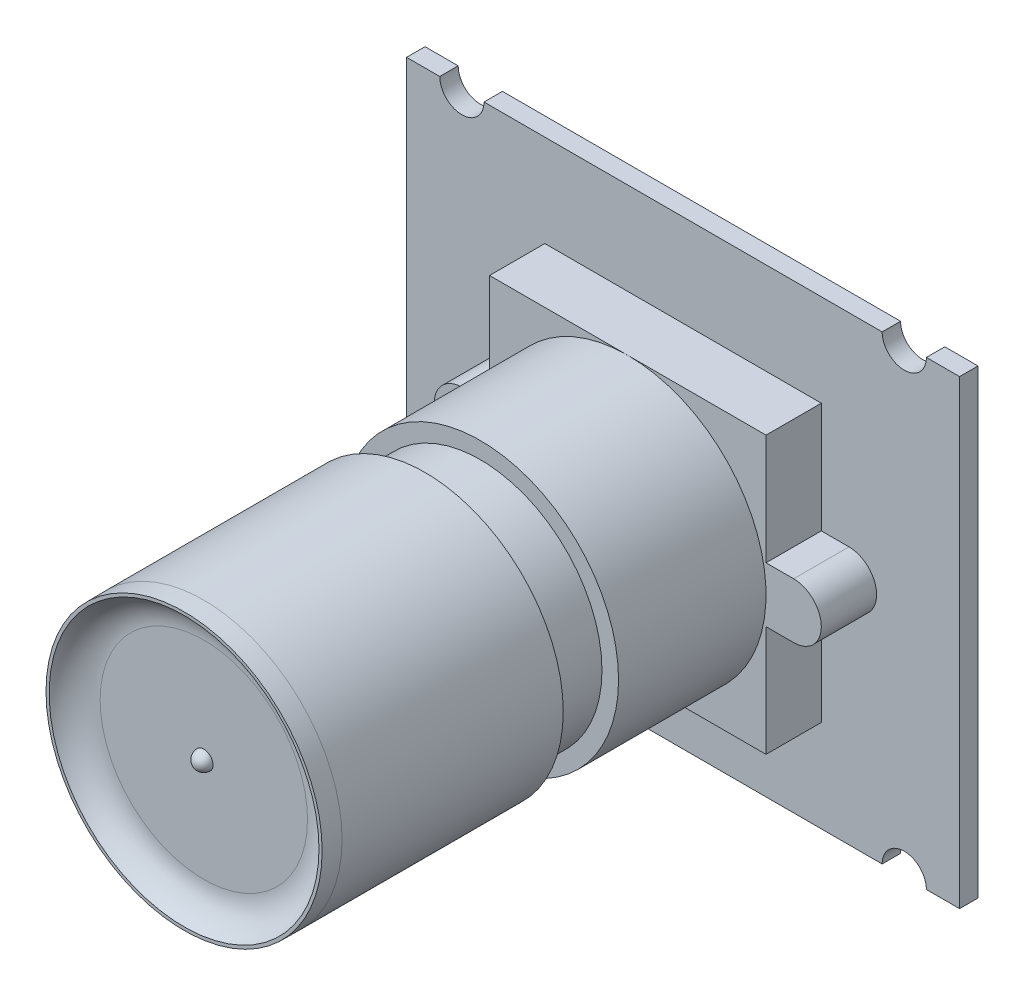
ISO-10303-21;
HEADER;
FILE_DESCRIPTION(('STEP AP214'),'2;1');
FILE_NAME('part.step','',(''),(''),'','','');
FILE_SCHEMA(('AUTOMOTIVE_DESIGN { 1 0 10303 214 1 1 1 1 }'));
ENDSEC;
DATA;
#1=APPLICATION_CONTEXT('core data for automotive mechanical design processes');
#2=APPLICATION_PROTOCOL_DEFINITION('international standard','automotive_design',2000,#1);
#3=PRODUCT_CONTEXT('',#1,'mechanical');
#4=PRODUCT('Part','Part','',(#3));
#5=PRODUCT_RELATED_PRODUCT_CATEGORY('part','',(#4));
#6=PRODUCT_DEFINITION_FORMATION('','',#4);
#7=PRODUCT_DEFINITION_CONTEXT('part definition',#1,'design');
#8=PRODUCT_DEFINITION('design','',#6,#7);
#9=PRODUCT_DEFINITION_SHAPE('','',#8);
#10=(LENGTH_UNIT() NAMED_UNIT(*) SI_UNIT(.MILLI.,.METRE.));
#11=(NAMED_UNIT(*) PLANE_ANGLE_UNIT() SI_UNIT($,.RADIAN.));
#12=(NAMED_UNIT(*) SI_UNIT($,.STERADIAN.) SOLID_ANGLE_UNIT());
#13=UNCERTAINTY_MEASURE_WITH_UNIT(LENGTH_MEASURE(1.E-05),#10,'distance_accuracy_value','');
#14=(GEOMETRIC_REPRESENTATION_CONTEXT(3) GLOBAL_UNCERTAINTY_ASSIGNED_CONTEXT((#13)) GLOBAL_UNIT_ASSIGNED_CONTEXT((#10,
#11,#12)) REPRESENTATION_CONTEXT('',''));
#15=CARTESIAN_POINT('',(0.,0.,0.));
#16=DIRECTION('',(0.,0.,1.));
#17=DIRECTION('',(1.,0.,0.));
#18=AXIS2_PLACEMENT_3D('',#15,#16,#17);
#19=CARTESIAN_POINT('',(6.,-3.54395604395604,4.));
#20=DIRECTION('',(0.,0.,1.));
#21=DIRECTION('',(1.,0.,0.));
#22=AXIS2_PLACEMENT_3D('',#19,#20,#21);
#23=PLANE('',#22);
#24=CARTESIAN_POINT('',(15.,-3.54395604395604,4.));
#25=DIRECTION('',(0.,0.,1.));
#26=DIRECTION('',(1.,0.,0.));
#27=AXIS2_PLACEMENT_3D('',#24,#25,#26);
#28=CIRCLE('',#27,7.5);
#29=CARTESIAN_POINT('',(15.,3.95604395604396,4.));
#30=VERTEX_POINT('',#29);
#31=CARTESIAN_POINT('',(15.,-11.043956043956,4.));
#32=VERTEX_POINT('',#31);
#33=EDGE_CURVE('E240',#30,#32,#28,.T.);
#34=ORIENTED_EDGE('',*,*,#33,.F.);
#35=DIRECTION('',(-1.,0.,0.));
#36=VECTOR('',#35,1.);
#37=CARTESIAN_POINT('',(7.5,3.95604395604396,4.));
#38=LINE('',#37,#36);
#39=CARTESIAN_POINT('',(7.5,3.95604395604396,4.));
#40=VERTEX_POINT('',#39);
#41=EDGE_CURVE('E222',#30,#40,#38,.T.);
#42=ORIENTED_EDGE('',*,*,#41,.T.);
#43=DIRECTION('',(0.,-1.,0.));
#44=VECTOR('',#43,1.);
#45=CARTESIAN_POINT('',(7.5,3.95604395604396,4.));
#46=LINE('',#45,#44);
#47=CARTESIAN_POINT('',(7.5,-2.04395604395604,4.));
#48=VERTEX_POINT('',#47);
#49=EDGE_CURVE('E255',#40,#48,#46,.T.);
#50=ORIENTED_EDGE('',*,*,#49,.T.);
#51=DIRECTION('',(-1.,0.,0.));
#52=VECTOR('',#51,1.);
#53=CARTESIAN_POINT('',(6.,-2.04395604395604,4.));
#54=LINE('',#53,#52);
#55=CARTESIAN_POINT('',(6.,-2.04395604395604,4.));
#56=VERTEX_POINT('',#55);
#57=EDGE_CURVE('E315',#48,#56,#54,.T.);
#58=ORIENTED_EDGE('',*,*,#57,.T.);
#59=CARTESIAN_POINT('',(6.,-3.54395604395604,4.));
#60=DIRECTION('',(0.,0.,1.));
#61=DIRECTION('',(1.,0.,0.));
#62=AXIS2_PLACEMENT_3D('',#59,#60,#61);
#63=CIRCLE('',#62,1.5);
#64=CARTESIAN_POINT('',(6.,-5.04395604395604,4.));
#65=VERTEX_POINT('',#64);
#66=EDGE_CURVE('E299',#56,#65,#63,.T.);
#67=ORIENTED_EDGE('',*,*,#66,.T.);
#68=DIRECTION('',(1.,0.,0.));
#69=VECTOR('',#68,1.);
#70=CARTESIAN_POINT('',(6.,-5.04395604395604,4.));
#71=LINE('',#70,#69);
#72=CARTESIAN_POINT('',(7.5,-5.04395604395604,4.));
#73=VERTEX_POINT('',#72);
#74=EDGE_CURVE('E304',#65,#73,#71,.T.);
#75=ORIENTED_EDGE('',*,*,#74,.T.);
#76=CARTESIAN_POINT('',(7.5,-11.043956043956,4.));
#77=VERTEX_POINT('',#76);
#78=EDGE_CURVE('E257',#73,#77,#46,.T.);
#79=ORIENTED_EDGE('',*,*,#78,.T.);
#80=DIRECTION('',(1.,0.,0.));
#81=VECTOR('',#80,1.);
#82=CARTESIAN_POINT('',(7.5,-11.043956043956,4.));
#83=LINE('',#82,#81);
#84=EDGE_CURVE('E237',#77,#32,#83,.T.);
#85=ORIENTED_EDGE('',*,*,#84,.T.);
#86=EDGE_LOOP('',(#34,#42,#50,#58,#67,#75,#79,#85));
#87=FACE_BOUND('',#86,.T.);
#88=ADVANCED_FACE('F44',(#87),#23,.T.);
#89=CARTESIAN_POINT('',(6.,-5.04395604395604,4.));
#90=DIRECTION('',(0.,1.,0.));
#91=DIRECTION('',(0.,0.,1.));
#92=AXIS2_PLACEMENT_3D('',#89,#90,#91);
#93=PLANE('',#92);
#94=DIRECTION('',(0.,0.,-1.));
#95=VECTOR('',#94,1.);
#96=CARTESIAN_POINT('',(7.5,-5.04395604395604,4.));
#97=LINE('',#96,#95);
#98=CARTESIAN_POINT('',(7.5,-5.04395604395604,1.));
#99=VERTEX_POINT('',#98);
#100=EDGE_CURVE('E295',#73,#99,#97,.T.);
#101=ORIENTED_EDGE('',*,*,#100,.F.);
#102=ORIENTED_EDGE('',*,*,#74,.F.);
#103=DIRECTION('',(0.,0.,-1.));
#104=VECTOR('',#103,1.);
#105=CARTESIAN_POINT('',(6.,-5.04395604395604,4.));
#106=LINE('',#105,#104);
#107=CARTESIAN_POINT('',(6.,-5.04395604395604,1.));
#108=VERTEX_POINT('',#107);
#109=EDGE_CURVE('E344',#65,#108,#106,.T.);
#110=ORIENTED_EDGE('',*,*,#109,.T.);
#111=DIRECTION('',(1.,0.,0.));
#112=VECTOR('',#111,1.);
#113=CARTESIAN_POINT('',(6.,-5.04395604395604,1.));
#114=LINE('',#113,#112);
#115=EDGE_CURVE('E322',#108,#99,#114,.T.);
#116=ORIENTED_EDGE('',*,*,#115,.T.);
#117=EDGE_LOOP('',(#101,#102,#110,#116));
#118=FACE_BOUND('',#117,.T.);
#119=ADVANCED_FACE('F536',(#118),#93,.F.);
#120=DIRECTION('',(0.,0.,1.));
#121=VECTOR('',#120,1.);
#122=CARTESIAN_POINT('',(22.5,-5.04395604395604,4.));
#123=LINE('',#122,#121);
#124=CARTESIAN_POINT('',(22.5,-5.04395604395604,1.));
#125=VERTEX_POINT('',#124);
#126=CARTESIAN_POINT('',(22.5,-5.04395604395604,4.));
#127=VERTEX_POINT('',#126);
#128=EDGE_CURVE('E289',#125,#127,#123,.T.);
#129=ORIENTED_EDGE('',*,*,#128,.F.);
#130=CARTESIAN_POINT('',(24.,-5.04395604395604,1.));
#131=VERTEX_POINT('',#130);
#132=EDGE_CURVE('E318',#125,#131,#114,.T.);
#133=ORIENTED_EDGE('',*,*,#132,.T.);
#134=DIRECTION('',(0.,0.,-1.));
#135=VECTOR('',#134,1.);
#136=CARTESIAN_POINT('',(24.,-5.04395604395604,4.));
#137=LINE('',#136,#135);
#138=CARTESIAN_POINT('',(24.,-5.04395604395604,4.));
#139=VERTEX_POINT('',#138);
#140=EDGE_CURVE('E339',#139,#131,#137,.T.);
#141=ORIENTED_EDGE('',*,*,#140,.F.);
#142=EDGE_CURVE('E303',#127,#139,#71,.T.);
#143=ORIENTED_EDGE('',*,*,#142,.F.);
#144=EDGE_LOOP('',(#129,#133,#141,#143));
#145=FACE_BOUND('',#144,.T.);
#146=ADVANCED_FACE('F546',(#145),#93,.F.);
#147=CARTESIAN_POINT('',(6.,-2.04395604395604,4.));
#148=DIRECTION('',(0.,-1.,0.));
#149=DIRECTION('',(0.,0.,-1.));
#150=AXIS2_PLACEMENT_3D('',#147,#148,#149);
#151=PLANE('',#150);
#152=DIRECTION('',(0.,0.,1.));
#153=VECTOR('',#152,1.);
#154=CARTESIAN_POINT('',(7.5,-2.04395604395604,4.));
#155=LINE('',#154,#153);
#156=CARTESIAN_POINT('',(7.5,-2.04395604395604,1.));
#157=VERTEX_POINT('',#156);
#158=EDGE_CURVE('E47',#157,#48,#155,.T.);
#159=ORIENTED_EDGE('',*,*,#158,.F.);
#160=DIRECTION('',(-1.,0.,0.));
#161=VECTOR('',#160,1.);
#162=CARTESIAN_POINT('',(6.,-2.04395604395604,1.));
#163=LINE('',#162,#161);
#164=CARTESIAN_POINT('',(6.,-2.04395604395604,1.));
#165=VERTEX_POINT('',#164);
#166=EDGE_CURVE('E326',#157,#165,#163,.T.);
#167=ORIENTED_EDGE('',*,*,#166,.T.);
#168=DIRECTION('',(0.,0.,-1.));
#169=VECTOR('',#168,1.);
#170=CARTESIAN_POINT('',(6.,-2.04395604395604,4.));
#171=LINE('',#170,#169);
#172=EDGE_CURVE('E317',#56,#165,#171,.T.);
#173=ORIENTED_EDGE('',*,*,#172,.F.);
#174=ORIENTED_EDGE('',*,*,#57,.F.);
#175=EDGE_LOOP('',(#159,#167,#173,#174));
#176=FACE_BOUND('',#175,.T.);
#177=ADVANCED_FACE('F570',(#176),#151,.F.);
#178=DIRECTION('',(0.,0.,-1.));
#179=VECTOR('',#178,1.);
#180=CARTESIAN_POINT('',(22.5,-2.04395604395604,4.));
#181=LINE('',#180,#179);
#182=CARTESIAN_POINT('',(22.5,-2.04395604395604,4.));
#183=VERTEX_POINT('',#182);
#184=CARTESIAN_POINT('',(22.5,-2.04395604395604,1.));
#185=VERTEX_POINT('',#184);
#186=EDGE_CURVE('E248',#183,#185,#181,.T.);
#187=ORIENTED_EDGE('',*,*,#186,.F.);
#188=CARTESIAN_POINT('',(24.,-2.04395604395604,4.));
#189=VERTEX_POINT('',#188);
#190=EDGE_CURVE('E312',#189,#183,#54,.T.);
#191=ORIENTED_EDGE('',*,*,#190,.F.);
#192=DIRECTION('',(0.,0.,-1.));
#193=VECTOR('',#192,1.);
#194=CARTESIAN_POINT('',(24.,-2.04395604395604,4.));
#195=LINE('',#194,#193);
#196=CARTESIAN_POINT('',(24.,-2.04395604395604,1.));
#197=VERTEX_POINT('',#196);
#198=EDGE_CURVE('E334',#189,#197,#195,.T.);
#199=ORIENTED_EDGE('',*,*,#198,.T.);
#200=EDGE_CURVE('E302',#197,#185,#163,.T.);
#201=ORIENTED_EDGE('',*,*,#200,.T.);
#202=EDGE_LOOP('',(#187,#191,#199,#201));
#203=FACE_BOUND('',#202,.T.);
#204=ADVANCED_FACE('F477',(#203),#151,.F.);
#205=CARTESIAN_POINT('',(0.,8.95604395604396,1.));
#206=DIRECTION('',(1.,0.,0.));
#207=DIRECTION('',(0.,1.,0.));
#208=AXIS2_PLACEMENT_3D('',#205,#206,#207);
#209=PLANE('',#208);
#210=DIRECTION('',(0.,-1.,0.));
#211=VECTOR('',#210,1.);
#212=CARTESIAN_POINT('',(0.,8.95604395604396,0.));
#213=LINE('',#212,#211);
#214=CARTESIAN_POINT('',(0.,8.95604395604396,0.));
#215=VERTEX_POINT('',#214);
#216=CARTESIAN_POINT('',(0.,-16.043956043956,0.));
#217=VERTEX_POINT('',#216);
#218=EDGE_CURVE('E350',#215,#217,#213,.T.);
#219=ORIENTED_EDGE('',*,*,#218,.T.);
#220=DIRECTION('',(0.,0.,-1.));
#221=VECTOR('',#220,1.);
#222=CARTESIAN_POINT('',(0.,-16.043956043956,1.));
#223=LINE('',#222,#221);
#224=CARTESIAN_POINT('',(0.,-16.043956043956,1.));
#225=VERTEX_POINT('',#224);
#226=EDGE_CURVE('E464',#225,#217,#223,.T.);
#227=ORIENTED_EDGE('',*,*,#226,.F.);
#228=DIRECTION('',(0.,-1.,0.));
#229=VECTOR('',#228,1.);
#230=CARTESIAN_POINT('',(0.,8.95604395604396,1.));
#231=LINE('',#230,#229);
#232=CARTESIAN_POINT('',(0.,8.95604395604396,1.));
#233=VERTEX_POINT('',#232);
#234=EDGE_CURVE('E349',#233,#225,#231,.T.);
#235=ORIENTED_EDGE('',*,*,#234,.F.);
#236=DIRECTION('',(0.,0.,-1.));
#237=VECTOR('',#236,1.);
#238=CARTESIAN_POINT('',(0.,8.95604395604396,1.));
#239=LINE('',#238,#237);
#240=EDGE_CURVE('E387',#233,#215,#239,.T.);
#241=ORIENTED_EDGE('',*,*,#240,.T.);
#242=EDGE_LOOP('',(#219,#227,#235,#241));
#243=FACE_BOUND('',#242,.T.);
#244=ADVANCED_FACE('F50',(#243),#209,.F.);
#245=CARTESIAN_POINT('',(0.,-16.043956043956,1.));
#246=DIRECTION('',(0.,1.,0.));
#247=DIRECTION('',(0.,0.,1.));
#248=AXIS2_PLACEMENT_3D('',#245,#246,#247);
#249=PLANE('',#248);
#250=DIRECTION('',(1.,0.,0.));
#251=VECTOR('',#250,1.);
#252=CARTESIAN_POINT('',(0.,-16.043956043956,0.));
#253=LINE('',#252,#251);
#254=CARTESIAN_POINT('',(1.8,-16.043956043956,0.));
#255=VERTEX_POINT('',#254);
#256=EDGE_CURVE('E388',#217,#255,#253,.T.);
#257=ORIENTED_EDGE('',*,*,#256,.T.);
#258=DIRECTION('',(0.,0.,-1.));
#259=VECTOR('',#258,1.);
#260=CARTESIAN_POINT('',(1.8,-16.043956043956,1.));
#261=LINE('',#260,#259);
#262=CARTESIAN_POINT('',(1.8,-16.043956043956,1.));
#263=VERTEX_POINT('',#262);
#264=EDGE_CURVE('E461',#263,#255,#261,.T.);
#265=ORIENTED_EDGE('',*,*,#264,.F.);
#266=DIRECTION('',(1.,0.,0.));
#267=VECTOR('',#266,1.);
#268=CARTESIAN_POINT('',(0.,-16.043956043956,1.));
#269=LINE('',#268,#267);
#270=EDGE_CURVE('E355',#225,#263,#269,.T.);
#271=ORIENTED_EDGE('',*,*,#270,.F.);
#272=ORIENTED_EDGE('',*,*,#226,.T.);
#273=EDGE_LOOP('',(#257,#265,#271,#272));
#274=FACE_BOUND('',#273,.T.);
#275=ADVANCED_FACE('F615',(#274),#249,.F.);
#276=CARTESIAN_POINT('',(3.,-16.043956043956,1.));
#277=DIRECTION('',(0.,0.,-1.));
#278=DIRECTION('',(-1.,0.,0.));
#279=AXIS2_PLACEMENT_3D('',#276,#277,#278);
#280=CYLINDRICAL_SURFACE('',#279,1.2);
#281=CARTESIAN_POINT('',(3.,-16.043956043956,0.));
#282=DIRECTION('',(0.,0.,-1.));
#283=DIRECTION('',(1.,0.,0.));
#284=AXIS2_PLACEMENT_3D('',#281,#282,#283);
#285=CIRCLE('',#284,1.2);
#286=CARTESIAN_POINT('',(4.2,-16.043956043956,0.));
#287=VERTEX_POINT('',#286);
#288=EDGE_CURVE('E394',#255,#287,#285,.T.);
#289=ORIENTED_EDGE('',*,*,#288,.T.);
#290=DIRECTION('',(0.,0.,-1.));
#291=VECTOR('',#290,1.);
#292=CARTESIAN_POINT('',(4.2,-16.043956043956,1.));
#293=LINE('',#292,#291);
#294=CARTESIAN_POINT('',(4.2,-16.043956043956,1.));
#295=VERTEX_POINT('',#294);
#296=EDGE_CURVE('E460',#295,#287,#293,.T.);
#297=ORIENTED_EDGE('',*,*,#296,.F.);
#298=CARTESIAN_POINT('',(3.,-16.043956043956,1.));
#299=DIRECTION('',(0.,0.,-1.));
#300=DIRECTION('',(1.,0.,0.));
#301=AXIS2_PLACEMENT_3D('',#298,#299,#300);
#302=CIRCLE('',#301,1.2);
#303=EDGE_CURVE('E358',#263,#295,#302,.T.);
#304=ORIENTED_EDGE('',*,*,#303,.F.);
#305=ORIENTED_EDGE('',*,*,#264,.T.);
#306=EDGE_LOOP('',(#289,#297,#304,#305));
#307=FACE_BOUND('',#306,.T.);
#308=ADVANCED_FACE('F606',(#307),#280,.F.);
#309=CARTESIAN_POINT('',(4.2,-16.043956043956,1.));
#310=DIRECTION('',(0.,1.,0.));
#311=DIRECTION('',(0.,0.,1.));
#312=AXIS2_PLACEMENT_3D('',#309,#310,#311);
#313=PLANE('',#312);
#314=DIRECTION('',(1.,0.,0.));
#315=VECTOR('',#314,1.);
#316=CARTESIAN_POINT('',(4.2,-16.043956043956,0.));
#317=LINE('',#316,#315);
#318=CARTESIAN_POINT('',(25.8,-16.043956043956,0.));
#319=VERTEX_POINT('',#318);
#320=EDGE_CURVE('E396',#287,#319,#317,.T.);
#321=ORIENTED_EDGE('',*,*,#320,.T.);
#322=DIRECTION('',(0.,0.,-1.));
#323=VECTOR('',#322,1.);
#324=CARTESIAN_POINT('',(25.8,-16.043956043956,1.));
#325=LINE('',#324,#323);
#326=CARTESIAN_POINT('',(25.8,-16.043956043956,1.));
#327=VERTEX_POINT('',#326);
#328=EDGE_CURVE('E454',#327,#319,#325,.T.);
#329=ORIENTED_EDGE('',*,*,#328,.F.);
#330=DIRECTION('',(1.,0.,0.));
#331=VECTOR('',#330,1.);
#332=CARTESIAN_POINT('',(4.2,-16.043956043956,1.));
#333=LINE('',#332,#331);
#334=EDGE_CURVE('E360',#295,#327,#333,.T.);
#335=ORIENTED_EDGE('',*,*,#334,.F.);
#336=ORIENTED_EDGE('',*,*,#296,.T.);
#337=EDGE_LOOP('',(#321,#329,#335,#336));
#338=FACE_BOUND('',#337,.T.);
#339=ADVANCED_FACE('F603',(#338),#313,.F.);
#340=CARTESIAN_POINT('',(27.,-16.043956043956,1.));
#341=DIRECTION('',(0.,0.,-1.));
#342=DIRECTION('',(-1.,0.,0.));
#343=AXIS2_PLACEMENT_3D('',#340,#341,#342);
#344=CYLINDRICAL_SURFACE('',#343,1.2);
#345=CARTESIAN_POINT('',(27.,-16.043956043956,0.));
#346=DIRECTION('',(0.,0.,-1.));
#347=DIRECTION('',(1.,0.,0.));
#348=AXIS2_PLACEMENT_3D('',#345,#346,#347);
#349=CIRCLE('',#348,1.2);
#350=CARTESIAN_POINT('',(28.2,-16.043956043956,0.));
#351=VERTEX_POINT('',#350);
#352=EDGE_CURVE('E398',#319,#351,#349,.T.);
#353=ORIENTED_EDGE('',*,*,#352,.T.);
#354=DIRECTION('',(0.,0.,-1.));
#355=VECTOR('',#354,1.);
#356=CARTESIAN_POINT('',(28.2,-16.043956043956,1.));
#357=LINE('',#356,#355);
#358=CARTESIAN_POINT('',(28.2,-16.043956043956,1.));
#359=VERTEX_POINT('',#358);
#360=EDGE_CURVE('E446',#359,#351,#357,.T.);
#361=ORIENTED_EDGE('',*,*,#360,.F.);
#362=CARTESIAN_POINT('',(27.,-16.043956043956,1.));
#363=DIRECTION('',(0.,0.,-1.));
#364=DIRECTION('',(1.,0.,0.));
#365=AXIS2_PLACEMENT_3D('',#362,#363,#364);
#366=CIRCLE('',#365,1.2);
#367=EDGE_CURVE('E365',#327,#359,#366,.T.);
#368=ORIENTED_EDGE('',*,*,#367,.F.);
#369=ORIENTED_EDGE('',*,*,#328,.T.);
#370=EDGE_LOOP('',(#353,#361,#368,#369));
#371=FACE_BOUND('',#370,.T.);
#372=ADVANCED_FACE('F602',(#371),#344,.F.);
#373=CARTESIAN_POINT('',(28.2,-16.043956043956,1.));
#374=DIRECTION('',(0.,1.,0.));
#375=DIRECTION('',(0.,0.,1.));
#376=AXIS2_PLACEMENT_3D('',#373,#374,#375);
#377=PLANE('',#376);
#378=DIRECTION('',(1.,0.,0.));
#379=VECTOR('',#378,1.);
#380=CARTESIAN_POINT('',(28.2,-16.043956043956,0.));
#381=LINE('',#380,#379);
#382=CARTESIAN_POINT('',(30.,-16.043956043956,0.));
#383=VERTEX_POINT('',#382);
#384=EDGE_CURVE('E405',#351,#383,#381,.T.);
#385=ORIENTED_EDGE('',*,*,#384,.T.);
#386=DIRECTION('',(0.,0.,-1.));
#387=VECTOR('',#386,1.);
#388=CARTESIAN_POINT('',(30.,-16.043956043956,1.));
#389=LINE('',#388,#387);
#390=CARTESIAN_POINT('',(30.,-16.043956043956,1.));
#391=VERTEX_POINT('',#390);
#392=EDGE_CURVE('E444',#391,#383,#389,.T.);
#393=ORIENTED_EDGE('',*,*,#392,.F.);
#394=DIRECTION('',(1.,0.,0.));
#395=VECTOR('',#394,1.);
#396=CARTESIAN_POINT('',(28.2,-16.043956043956,1.));
#397=LINE('',#396,#395);
#398=EDGE_CURVE('E362',#359,#391,#397,.T.);
#399=ORIENTED_EDGE('',*,*,#398,.F.);
#400=ORIENTED_EDGE('',*,*,#360,.T.);
#401=EDGE_LOOP('',(#385,#393,#399,#400));
#402=FACE_BOUND('',#401,.T.);
#403=ADVANCED_FACE('F600',(#402),#377,.F.);
#404=CARTESIAN_POINT('',(30.,8.95604395604396,1.));
#405=DIRECTION('',(-1.,0.,0.));
#406=DIRECTION('',(0.,-1.,0.));
#407=AXIS2_PLACEMENT_3D('',#404,#405,#406);
#408=PLANE('',#407);
#409=DIRECTION('',(0.,1.,0.));
#410=VECTOR('',#409,1.);
#411=CARTESIAN_POINT('',(30.,8.95604395604396,0.));
#412=LINE('',#411,#410);
#413=CARTESIAN_POINT('',(30.,8.95604395604396,0.));
#414=VERTEX_POINT('',#413);
#415=EDGE_CURVE('E403',#383,#414,#412,.T.);
#416=ORIENTED_EDGE('',*,*,#415,.T.);
#417=DIRECTION('',(0.,0.,-1.));
#418=VECTOR('',#417,1.);
#419=CARTESIAN_POINT('',(30.,8.95604395604396,1.));
#420=LINE('',#419,#418);
#421=CARTESIAN_POINT('',(30.,8.95604395604396,1.));
#422=VERTEX_POINT('',#421);
#423=EDGE_CURVE('E441',#422,#414,#420,.T.);
#424=ORIENTED_EDGE('',*,*,#423,.F.);
#425=DIRECTION('',(0.,1.,0.));
#426=VECTOR('',#425,1.);
#427=CARTESIAN_POINT('',(30.,8.95604395604396,1.));
#428=LINE('',#427,#426);
#429=EDGE_CURVE('E368',#391,#422,#428,.T.);
#430=ORIENTED_EDGE('',*,*,#429,.F.);
#431=ORIENTED_EDGE('',*,*,#392,.T.);
#432=EDGE_LOOP('',(#416,#424,#430,#431));
#433=FACE_BOUND('',#432,.T.);
#434=ADVANCED_FACE('F592',(#433),#408,.F.);
#435=CARTESIAN_POINT('',(28.2,8.95604395604396,1.));
#436=DIRECTION('',(0.,-1.,0.));
#437=DIRECTION('',(0.,0.,-1.));
#438=AXIS2_PLACEMENT_3D('',#435,#436,#437);
#439=PLANE('',#438);
#440=DIRECTION('',(-1.,0.,0.));
#441=VECTOR('',#440,1.);
#442=CARTESIAN_POINT('',(28.2,8.95604395604396,0.));
#443=LINE('',#442,#441);
#444=CARTESIAN_POINT('',(28.2,8.95604395604396,0.));
#445=VERTEX_POINT('',#444);
#446=EDGE_CURVE('E409',#414,#445,#443,.T.);
#447=ORIENTED_EDGE('',*,*,#446,.T.);
#448=DIRECTION('',(0.,0.,-1.));
#449=VECTOR('',#448,1.);
#450=CARTESIAN_POINT('',(28.2,8.95604395604396,1.));
#451=LINE('',#450,#449);
#452=CARTESIAN_POINT('',(28.2,8.95604395604396,1.));
#453=VERTEX_POINT('',#452);
#454=EDGE_CURVE('E440',#453,#445,#451,.T.);
#455=ORIENTED_EDGE('',*,*,#454,.F.);
#456=DIRECTION('',(-1.,0.,0.));
#457=VECTOR('',#456,1.);
#458=CARTESIAN_POINT('',(28.2,8.95604395604396,1.));
#459=LINE('',#458,#457);
#460=EDGE_CURVE('E371',#422,#453,#459,.T.);
#461=ORIENTED_EDGE('',*,*,#460,.F.);
#462=ORIENTED_EDGE('',*,*,#423,.T.);
#463=EDGE_LOOP('',(#447,#455,#461,#462));
#464=FACE_BOUND('',#463,.T.);
#465=ADVANCED_FACE('F586',(#464),#439,.F.);
#466=CARTESIAN_POINT('',(27.,8.95604395604396,1.));
#467=DIRECTION('',(0.,0.,-1.));
#468=DIRECTION('',(-1.,0.,0.));
#469=AXIS2_PLACEMENT_3D('',#466,#467,#468);
#470=CYLINDRICAL_SURFACE('',#469,1.2);
#471=CARTESIAN_POINT('',(27.,8.95604395604396,0.));
#472=DIRECTION('',(0.,0.,-1.));
#473=DIRECTION('',(1.,0.,0.));
#474=AXIS2_PLACEMENT_3D('',#471,#472,#473);
#475=CIRCLE('',#474,1.2);
#476=CARTESIAN_POINT('',(25.8,8.95604395604396,0.));
#477=VERTEX_POINT('',#476);
#478=EDGE_CURVE('E412',#445,#477,#475,.T.);
#479=ORIENTED_EDGE('',*,*,#478,.T.);
#480=DIRECTION('',(0.,0.,-1.));
#481=VECTOR('',#480,1.);
#482=CARTESIAN_POINT('',(25.8,8.95604395604396,1.));
#483=LINE('',#482,#481);
#484=CARTESIAN_POINT('',(25.8,8.95604395604396,1.));
#485=VERTEX_POINT('',#484);
#486=EDGE_CURVE('E433',#485,#477,#483,.T.);
#487=ORIENTED_EDGE('',*,*,#486,.F.);
#488=CARTESIAN_POINT('',(27.,8.95604395604396,1.));
#489=DIRECTION('',(0.,0.,-1.));
#490=DIRECTION('',(1.,0.,0.));
#491=AXIS2_PLACEMENT_3D('',#488,#489,#490);
#492=CIRCLE('',#491,1.2);
#493=EDGE_CURVE('E372',#453,#485,#492,.T.);
#494=ORIENTED_EDGE('',*,*,#493,.F.);
#495=ORIENTED_EDGE('',*,*,#454,.T.);
#496=EDGE_LOOP('',(#479,#487,#494,#495));
#497=FACE_BOUND('',#496,.T.);
#498=ADVANCED_FACE('F583',(#497),#470,.F.);
#499=CARTESIAN_POINT('',(4.2,8.95604395604396,1.));
#500=DIRECTION('',(0.,-1.,0.));
#501=DIRECTION('',(0.,0.,-1.));
#502=AXIS2_PLACEMENT_3D('',#499,#500,#501);
#503=PLANE('',#502);
#504=DIRECTION('',(-1.,0.,0.));
#505=VECTOR('',#504,1.);
#506=CARTESIAN_POINT('',(4.2,8.95604395604396,0.));
#507=LINE('',#506,#505);
#508=CARTESIAN_POINT('',(4.2,8.95604395604396,0.));
#509=VERTEX_POINT('',#508);
#510=EDGE_CURVE('E411',#477,#509,#507,.T.);
#511=ORIENTED_EDGE('',*,*,#510,.T.);
#512=DIRECTION('',(0.,0.,-1.));
#513=VECTOR('',#512,1.);
#514=CARTESIAN_POINT('',(4.2,8.95604395604396,1.));
#515=LINE('',#514,#513);
#516=CARTESIAN_POINT('',(4.2,8.95604395604396,1.));
#517=VERTEX_POINT('',#516);
#518=EDGE_CURVE('E429',#517,#509,#515,.T.);
#519=ORIENTED_EDGE('',*,*,#518,.F.);
#520=DIRECTION('',(-1.,0.,0.));
#521=VECTOR('',#520,1.);
#522=CARTESIAN_POINT('',(4.2,8.95604395604396,1.));
#523=LINE('',#522,#521);
#524=EDGE_CURVE('E380',#485,#517,#523,.T.);
#525=ORIENTED_EDGE('',*,*,#524,.F.);
#526=ORIENTED_EDGE('',*,*,#486,.T.);
#527=EDGE_LOOP('',(#511,#519,#525,#526));
#528=FACE_BOUND('',#527,.T.);
#529=ADVANCED_FACE('F582',(#528),#503,.F.);
#530=CARTESIAN_POINT('',(3.,8.95604395604396,1.));
#531=DIRECTION('',(0.,0.,-1.));
#532=DIRECTION('',(-1.,0.,0.));
#533=AXIS2_PLACEMENT_3D('',#530,#531,#532);
#534=CYLINDRICAL_SURFACE('',#533,1.2);
#535=CARTESIAN_POINT('',(3.,8.95604395604396,0.));
#536=DIRECTION('',(0.,0.,-1.));
#537=DIRECTION('',(1.,0.,0.));
#538=AXIS2_PLACEMENT_3D('',#535,#536,#537);
#539=CIRCLE('',#538,1.2);
#540=CARTESIAN_POINT('',(1.8,8.95604395604396,0.));
#541=VERTEX_POINT('',#540);
#542=EDGE_CURVE('E420',#509,#541,#539,.T.);
#543=ORIENTED_EDGE('',*,*,#542,.T.);
#544=DIRECTION('',(0.,0.,-1.));
#545=VECTOR('',#544,1.);
#546=CARTESIAN_POINT('',(1.8,8.95604395604396,1.));
#547=LINE('',#546,#545);
#548=CARTESIAN_POINT('',(1.8,8.95604395604396,1.));
#549=VERTEX_POINT('',#548);
#550=EDGE_CURVE('E424',#549,#541,#547,.T.);
#551=ORIENTED_EDGE('',*,*,#550,.F.);
#552=CARTESIAN_POINT('',(3.,8.95604395604396,1.));
#553=DIRECTION('',(0.,0.,-1.));
#554=DIRECTION('',(1.,0.,0.));
#555=AXIS2_PLACEMENT_3D('',#552,#553,#554);
#556=CIRCLE('',#555,1.2);
#557=EDGE_CURVE('E379',#517,#549,#556,.T.);
#558=ORIENTED_EDGE('',*,*,#557,.F.);
#559=ORIENTED_EDGE('',*,*,#518,.T.);
#560=EDGE_LOOP('',(#543,#551,#558,#559));
#561=FACE_BOUND('',#560,.T.);
#562=ADVANCED_FACE('F580',(#561),#534,.F.);
#563=CARTESIAN_POINT('',(0.,8.95604395604396,1.));
#564=DIRECTION('',(0.,-1.,0.));
#565=DIRECTION('',(0.,0.,-1.));
#566=AXIS2_PLACEMENT_3D('',#563,#564,#565);
#567=PLANE('',#566);
#568=DIRECTION('',(-1.,0.,0.));
#569=VECTOR('',#568,1.);
#570=CARTESIAN_POINT('',(0.,8.95604395604396,0.));
#571=LINE('',#570,#569);
#572=EDGE_CURVE('E352',#541,#215,#571,.T.);
#573=ORIENTED_EDGE('',*,*,#572,.T.);
#574=ORIENTED_EDGE('',*,*,#240,.F.);
#575=DIRECTION('',(-1.,0.,0.));
#576=VECTOR('',#575,1.);
#577=CARTESIAN_POINT('',(0.,8.95604395604396,1.));
#578=LINE('',#577,#576);
#579=EDGE_CURVE('E384',#549,#233,#578,.T.);
#580=ORIENTED_EDGE('',*,*,#579,.F.);
#581=ORIENTED_EDGE('',*,*,#550,.T.);
#582=EDGE_LOOP('',(#573,#574,#580,#581));
#583=FACE_BOUND('',#582,.T.);
#584=ADVANCED_FACE('F571',(#583),#567,.F.);
#585=CARTESIAN_POINT('',(3.,-16.043956043956,1.));
#586=DIRECTION('',(0.,0.,1.));
#587=DIRECTION('',(1.,0.,0.));
#588=AXIS2_PLACEMENT_3D('',#585,#586,#587);
#589=PLANE('',#588);
#590=DIRECTION('',(0.,-1.,0.));
#591=VECTOR('',#590,1.);
#592=CARTESIAN_POINT('',(7.5,3.95604395604396,1.));
#593=LINE('',#592,#591);
#594=CARTESIAN_POINT('',(7.5,3.95604395604396,1.));
#595=VERTEX_POINT('',#594);
#596=EDGE_CURVE('E265',#595,#157,#593,.T.);
#597=ORIENTED_EDGE('',*,*,#596,.F.);
#598=DIRECTION('',(-1.,0.,0.));
#599=VECTOR('',#598,1.);
#600=CARTESIAN_POINT('',(7.5,3.95604395604396,1.));
#601=LINE('',#600,#599);
#602=CARTESIAN_POINT('',(22.5,3.95604395604396,1.));
#603=VERTEX_POINT('',#602);
#604=EDGE_CURVE('E274',#603,#595,#601,.T.);
#605=ORIENTED_EDGE('',*,*,#604,.F.);
#606=DIRECTION('',(0.,1.,0.));
#607=VECTOR('',#606,1.);
#608=CARTESIAN_POINT('',(22.5,3.95604395604396,1.));
#609=LINE('',#608,#607);
#610=EDGE_CURVE('E268',#185,#603,#609,.T.);
#611=ORIENTED_EDGE('',*,*,#610,.F.);
#612=ORIENTED_EDGE('',*,*,#200,.F.);
#613=CARTESIAN_POINT('',(24.,-3.54395604395604,1.));
#614=DIRECTION('',(0.,0.,1.));
#615=DIRECTION('',(1.,0.,0.));
#616=AXIS2_PLACEMENT_3D('',#613,#614,#615);
#617=CIRCLE('',#616,1.5);
#618=EDGE_CURVE('E323',#131,#197,#617,.T.);
#619=ORIENTED_EDGE('',*,*,#618,.F.);
#620=ORIENTED_EDGE('',*,*,#132,.F.);
#621=CARTESIAN_POINT('',(22.5,-11.043956043956,1.));
#622=VERTEX_POINT('',#621);
#623=EDGE_CURVE('E269',#622,#125,#609,.T.);
#624=ORIENTED_EDGE('',*,*,#623,.F.);
#625=DIRECTION('',(1.,0.,0.));
#626=VECTOR('',#625,1.);
#627=CARTESIAN_POINT('',(7.5,-11.043956043956,1.));
#628=LINE('',#627,#626);
#629=CARTESIAN_POINT('',(7.5,-11.043956043956,1.));
#630=VERTEX_POINT('',#629);
#631=EDGE_CURVE('E68',#630,#622,#628,.T.);
#632=ORIENTED_EDGE('',*,*,#631,.F.);
#633=EDGE_CURVE('E266',#99,#630,#593,.T.);
#634=ORIENTED_EDGE('',*,*,#633,.F.);
#635=ORIENTED_EDGE('',*,*,#115,.F.);
#636=CARTESIAN_POINT('',(6.,-3.54395604395604,1.));
#637=DIRECTION('',(0.,0.,1.));
#638=DIRECTION('',(1.,0.,0.));
#639=AXIS2_PLACEMENT_3D('',#636,#637,#638);
#640=CIRCLE('',#639,1.5);
#641=EDGE_CURVE('E296',#165,#108,#640,.T.);
#642=ORIENTED_EDGE('',*,*,#641,.F.);
#643=ORIENTED_EDGE('',*,*,#166,.F.);
#644=EDGE_LOOP('',(#597,#605,#611,#612,#619,#620,#624,#632,#634,#635,#642,#643));
#645=FACE_BOUND('',#644,.T.);
#646=ORIENTED_EDGE('',*,*,#234,.T.);
#647=ORIENTED_EDGE('',*,*,#270,.T.);
#648=ORIENTED_EDGE('',*,*,#303,.T.);
#649=ORIENTED_EDGE('',*,*,#334,.T.);
#650=ORIENTED_EDGE('',*,*,#367,.T.);
#651=ORIENTED_EDGE('',*,*,#398,.T.);
#652=ORIENTED_EDGE('',*,*,#429,.T.);
#653=ORIENTED_EDGE('',*,*,#460,.T.);
#654=ORIENTED_EDGE('',*,*,#493,.T.);
#655=ORIENTED_EDGE('',*,*,#524,.T.);
#656=ORIENTED_EDGE('',*,*,#557,.T.);
#657=ORIENTED_EDGE('',*,*,#579,.T.);
#658=EDGE_LOOP('',(#646,#647,#648,#649,#650,#651,#652,#653,#654,#655,#656,#657));
#659=FACE_BOUND('',#658,.T.);
#660=ADVANCED_FACE('F483',(#645,#659),#589,.T.);
#661=CARTESIAN_POINT('',(3.,-16.043956043956,0.));
#662=DIRECTION('',(0.,0.,1.));
#663=DIRECTION('',(1.,0.,0.));
#664=AXIS2_PLACEMENT_3D('',#661,#662,#663);
#665=PLANE('',#664);
#666=ORIENTED_EDGE('',*,*,#218,.F.);
#667=ORIENTED_EDGE('',*,*,#572,.F.);
#668=ORIENTED_EDGE('',*,*,#542,.F.);
#669=ORIENTED_EDGE('',*,*,#510,.F.);
#670=ORIENTED_EDGE('',*,*,#478,.F.);
#671=ORIENTED_EDGE('',*,*,#446,.F.);
#672=ORIENTED_EDGE('',*,*,#415,.F.);
#673=ORIENTED_EDGE('',*,*,#384,.F.);
#674=ORIENTED_EDGE('',*,*,#352,.F.);
#675=ORIENTED_EDGE('',*,*,#320,.F.);
#676=ORIENTED_EDGE('',*,*,#288,.F.);
#677=ORIENTED_EDGE('',*,*,#256,.F.);
#678=EDGE_LOOP('',(#666,#667,#668,#669,#670,#671,#672,#673,#674,#675,#676,#677));
#679=FACE_BOUND('',#678,.T.);
#680=ADVANCED_FACE('F562',(#679),#665,.F.);
#681=CARTESIAN_POINT('',(6.,-3.54395604395604,4.));
#682=DIRECTION('',(0.,0.,-1.));
#683=DIRECTION('',(-1.,0.,0.));
#684=AXIS2_PLACEMENT_3D('',#681,#682,#683);
#685=CYLINDRICAL_SURFACE('',#684,1.5);
#686=ORIENTED_EDGE('',*,*,#641,.T.);
#687=ORIENTED_EDGE('',*,*,#109,.F.);
#688=ORIENTED_EDGE('',*,*,#66,.F.);
#689=ORIENTED_EDGE('',*,*,#172,.T.);
#690=EDGE_LOOP('',(#686,#687,#688,#689));
#691=FACE_BOUND('',#690,.T.);
#692=ADVANCED_FACE('F559',(#691),#685,.T.);
#693=CARTESIAN_POINT('',(24.,-3.54395604395604,4.));
#694=DIRECTION('',(0.,0.,-1.));
#695=DIRECTION('',(-1.,0.,0.));
#696=AXIS2_PLACEMENT_3D('',#693,#694,#695);
#697=CYLINDRICAL_SURFACE('',#696,1.5);
#698=ORIENTED_EDGE('',*,*,#618,.T.);
#699=ORIENTED_EDGE('',*,*,#198,.F.);
#700=CARTESIAN_POINT('',(24.,-3.54395604395604,4.));
#701=DIRECTION('',(0.,0.,1.));
#702=DIRECTION('',(1.,0.,0.));
#703=AXIS2_PLACEMENT_3D('',#700,#701,#702);
#704=CIRCLE('',#703,1.5);
#705=EDGE_CURVE('E307',#139,#189,#704,.T.);
#706=ORIENTED_EDGE('',*,*,#705,.F.);
#707=ORIENTED_EDGE('',*,*,#140,.T.);
#708=EDGE_LOOP('',(#698,#699,#706,#707));
#709=FACE_BOUND('',#708,.T.);
#710=ADVANCED_FACE('F481',(#709),#697,.T.);
#711=EDGE_CURVE('E54',#32,#30,#28,.T.);
#712=ORIENTED_EDGE('',*,*,#711,.F.);
#713=CARTESIAN_POINT('',(22.5,-11.043956043956,4.));
#714=VERTEX_POINT('',#713);
#715=EDGE_CURVE('E253',#32,#714,#83,.T.);
#716=ORIENTED_EDGE('',*,*,#715,.T.);
#717=DIRECTION('',(0.,1.,0.));
#718=VECTOR('',#717,1.);
#719=CARTESIAN_POINT('',(22.5,3.95604395604396,4.));
#720=LINE('',#719,#718);
#721=EDGE_CURVE('E234',#714,#127,#720,.T.);
#722=ORIENTED_EDGE('',*,*,#721,.T.);
#723=ORIENTED_EDGE('',*,*,#142,.T.);
#724=ORIENTED_EDGE('',*,*,#705,.T.);
#725=ORIENTED_EDGE('',*,*,#190,.T.);
#726=CARTESIAN_POINT('',(22.5,3.95604395604396,4.));
#727=VERTEX_POINT('',#726);
#728=EDGE_CURVE('E220',#183,#727,#720,.T.);
#729=ORIENTED_EDGE('',*,*,#728,.T.);
#730=EDGE_CURVE('E215',#727,#30,#38,.T.);
#731=ORIENTED_EDGE('',*,*,#730,.T.);
#732=EDGE_LOOP('',(#712,#716,#722,#723,#724,#725,#729,#731));
#733=FACE_BOUND('',#732,.T.);
#734=ADVANCED_FACE('F211',(#733),#23,.T.);
#735=CARTESIAN_POINT('',(22.5,3.95604395604396,4.));
#736=DIRECTION('',(-1.,0.,0.));
#737=DIRECTION('',(0.,0.,1.));
#738=AXIS2_PLACEMENT_3D('',#735,#736,#737);
#739=PLANE('',#738);
#740=ORIENTED_EDGE('',*,*,#728,.F.);
#741=ORIENTED_EDGE('',*,*,#186,.T.);
#742=ORIENTED_EDGE('',*,*,#610,.T.);
#743=DIRECTION('',(0.,0.,-1.));
#744=VECTOR('',#743,1.);
#745=CARTESIAN_POINT('',(22.5,3.95604395604396,4.));
#746=LINE('',#745,#744);
#747=EDGE_CURVE('E276',#727,#603,#746,.T.);
#748=ORIENTED_EDGE('',*,*,#747,.F.);
#749=EDGE_LOOP('',(#740,#741,#742,#748));
#750=FACE_BOUND('',#749,.T.);
#751=ADVANCED_FACE('F475',(#750),#739,.F.);
#752=CARTESIAN_POINT('',(7.5,3.95604395604396,4.));
#753=DIRECTION('',(1.,0.,0.));
#754=DIRECTION('',(0.,0.,-1.));
#755=AXIS2_PLACEMENT_3D('',#752,#753,#754);
#756=PLANE('',#755);
#757=ORIENTED_EDGE('',*,*,#596,.T.);
#758=ORIENTED_EDGE('',*,*,#158,.T.);
#759=ORIENTED_EDGE('',*,*,#49,.F.);
#760=DIRECTION('',(0.,0.,-1.));
#761=VECTOR('',#760,1.);
#762=CARTESIAN_POINT('',(7.5,3.95604395604396,4.));
#763=LINE('',#762,#761);
#764=EDGE_CURVE('E225',#40,#595,#763,.T.);
#765=ORIENTED_EDGE('',*,*,#764,.T.);
#766=EDGE_LOOP('',(#757,#758,#759,#765));
#767=FACE_BOUND('',#766,.T.);
#768=ADVANCED_FACE('F554',(#767),#756,.F.);
#769=CARTESIAN_POINT('',(7.5,3.95604395604396,4.));
#770=DIRECTION('',(0.,-1.,0.));
#771=DIRECTION('',(0.,0.,-1.));
#772=AXIS2_PLACEMENT_3D('',#769,#770,#771);
#773=PLANE('',#772);
#774=ORIENTED_EDGE('',*,*,#604,.T.);
#775=ORIENTED_EDGE('',*,*,#764,.F.);
#776=ORIENTED_EDGE('',*,*,#41,.F.);
#777=ORIENTED_EDGE('',*,*,#730,.F.);
#778=ORIENTED_EDGE('',*,*,#747,.T.);
#779=EDGE_LOOP('',(#774,#775,#776,#777,#778));
#780=FACE_BOUND('',#779,.T.);
#781=ADVANCED_FACE('F226',(#780),#773,.F.);
#782=ORIENTED_EDGE('',*,*,#78,.F.);
#783=ORIENTED_EDGE('',*,*,#100,.T.);
#784=ORIENTED_EDGE('',*,*,#633,.T.);
#785=DIRECTION('',(0.,0.,-1.));
#786=VECTOR('',#785,1.);
#787=CARTESIAN_POINT('',(7.5,-11.043956043956,4.));
#788=LINE('',#787,#786);
#789=EDGE_CURVE('E286',#77,#630,#788,.T.);
#790=ORIENTED_EDGE('',*,*,#789,.F.);
#791=EDGE_LOOP('',(#782,#783,#784,#790));
#792=FACE_BOUND('',#791,.T.);
#793=ADVANCED_FACE('F676',(#792),#756,.F.);
#794=ORIENTED_EDGE('',*,*,#623,.T.);
#795=ORIENTED_EDGE('',*,*,#128,.T.);
#796=ORIENTED_EDGE('',*,*,#721,.F.);
#797=DIRECTION('',(0.,0.,-1.));
#798=VECTOR('',#797,1.);
#799=CARTESIAN_POINT('',(22.5,-11.043956043956,4.));
#800=LINE('',#799,#798);
#801=EDGE_CURVE('E285',#714,#622,#800,.T.);
#802=ORIENTED_EDGE('',*,*,#801,.T.);
#803=EDGE_LOOP('',(#794,#795,#796,#802));
#804=FACE_BOUND('',#803,.T.);
#805=ADVANCED_FACE('F560',(#804),#739,.F.);
#806=CARTESIAN_POINT('',(7.5,-11.043956043956,4.));
#807=DIRECTION('',(0.,1.,0.));
#808=DIRECTION('',(0.,0.,1.));
#809=AXIS2_PLACEMENT_3D('',#806,#807,#808);
#810=PLANE('',#809);
#811=ORIENTED_EDGE('',*,*,#631,.T.);
#812=ORIENTED_EDGE('',*,*,#801,.F.);
#813=ORIENTED_EDGE('',*,*,#715,.F.);
#814=ORIENTED_EDGE('',*,*,#84,.F.);
#815=ORIENTED_EDGE('',*,*,#789,.T.);
#816=EDGE_LOOP('',(#811,#812,#813,#814,#815));
#817=FACE_BOUND('',#816,.T.);
#818=ADVANCED_FACE('F688',(#817),#810,.F.);
#819=CARTESIAN_POINT('',(15.,-3.54395604395604,12.));
#820=DIRECTION('',(0.,0.,-1.));
#821=DIRECTION('',(-1.,0.,0.));
#822=AXIS2_PLACEMENT_3D('',#819,#820,#821);
#823=CYLINDRICAL_SURFACE('',#822,7.5);
#824=CARTESIAN_POINT('',(15.,-3.54395604395604,12.));
#825=DIRECTION('',(0.,0.,1.));
#826=DIRECTION('',(1.,0.,0.));
#827=AXIS2_PLACEMENT_3D('',#824,#825,#826);
#828=CIRCLE('',#827,7.5);
#829=CARTESIAN_POINT('',(22.5,-3.54395604395604,12.));
#830=VERTEX_POINT('',#829);
#831=EDGE_CURVE('E245',#830,#830,#828,.T.);
#832=ORIENTED_EDGE('',*,*,#831,.F.);
#833=EDGE_LOOP('',(#832));
#834=FACE_BOUND('',#833,.T.);
#835=ORIENTED_EDGE('',*,*,#33,.T.);
#836=ORIENTED_EDGE('',*,*,#711,.T.);
#837=EDGE_LOOP('',(#835,#836));
#838=FACE_BOUND('',#837,.T.);
#839=ADVANCED_FACE('F244',(#834,#838),#823,.T.);
#840=CARTESIAN_POINT('',(15.,-3.54395604395604,12.));
#841=DIRECTION('',(0.,0.,1.));
#842=DIRECTION('',(1.,0.,0.));
#843=AXIS2_PLACEMENT_3D('',#840,#841,#842);
#844=PLANE('',#843);
#845=CARTESIAN_POINT('',(15.,-3.54395604395604,12.));
#846=DIRECTION('',(0.,0.,1.));
#847=DIRECTION('',(1.,0.,0.));
#848=AXIS2_PLACEMENT_3D('',#845,#846,#847);
#849=CIRCLE('',#848,6.6);
#850=CARTESIAN_POINT('',(21.6,-3.54395604395604,12.));
#851=VERTEX_POINT('',#850);
#852=EDGE_CURVE('E11',#851,#851,#849,.T.);
#853=ORIENTED_EDGE('',*,*,#852,.F.);
#854=EDGE_LOOP('',(#853));
#855=FACE_BOUND('',#854,.T.);
#856=ORIENTED_EDGE('',*,*,#831,.T.);
#857=EDGE_LOOP('',(#856));
#858=FACE_BOUND('',#857,.T.);
#859=ADVANCED_FACE('F533',(#855,#858),#844,.T.);
#860=CARTESIAN_POINT('',(15.,-3.54395604395604,15.));
#861=DIRECTION('',(0.,0.,-1.));
#862=DIRECTION('',(-1.,0.,0.));
#863=AXIS2_PLACEMENT_3D('',#860,#861,#862);
#864=CYLINDRICAL_SURFACE('',#863,6.6);
#865=CARTESIAN_POINT('',(15.,-3.54395604395604,15.));
#866=DIRECTION('',(0.,0.,1.));
#867=DIRECTION('',(1.,0.,0.));
#868=AXIS2_PLACEMENT_3D('',#865,#866,#867);
#869=CIRCLE('',#868,6.6);
#870=CARTESIAN_POINT('',(21.6,-3.54395604395604,15.));
#871=VERTEX_POINT('',#870);
#872=EDGE_CURVE('E243',#871,#871,#869,.T.);
#873=ORIENTED_EDGE('',*,*,#872,.F.);
#874=EDGE_LOOP('',(#873));
#875=FACE_BOUND('',#874,.T.);
#876=ORIENTED_EDGE('',*,*,#852,.T.);
#877=EDGE_LOOP('',(#876));
#878=FACE_BOUND('',#877,.T.);
#879=ADVANCED_FACE('F523',(#875,#878),#864,.T.);
#880=CARTESIAN_POINT('',(15.,-3.54395604395604,15.));
#881=DIRECTION('',(0.,0.,-1.));
#882=DIRECTION('',(-1.,0.,0.));
#883=AXIS2_PLACEMENT_3D('',#880,#881,#882);
#884=PLANE('',#883);
#885=ORIENTED_EDGE('',*,*,#872,.T.);
#886=EDGE_LOOP('',(#885));
#887=FACE_BOUND('',#886,.T.);
#888=CARTESIAN_POINT('',(15.,-3.54395604395604,15.));
#889=DIRECTION('',(0.,0.,1.));
#890=DIRECTION('',(1.,0.,0.));
#891=AXIS2_PLACEMENT_3D('',#888,#889,#890);
#892=CIRCLE('',#891,7.5);
#893=CARTESIAN_POINT('',(22.5,-3.54395604395604,15.));
#894=VERTEX_POINT('',#893);
#895=EDGE_CURVE('E514',#894,#894,#892,.T.);
#896=ORIENTED_EDGE('',*,*,#895,.F.);
#897=EDGE_LOOP('',(#896));
#898=FACE_BOUND('',#897,.T.);
#899=ADVANCED_FACE('F525',(#887,#898),#884,.T.);
#900=CARTESIAN_POINT('',(15.,-3.54395604395604,27.0000245633117));
#901=DIRECTION('',(0.,0.,1.));
#902=DIRECTION('',(-1.,0.,0.));
#903=AXIS2_PLACEMENT_3D('',#900,#901,#902);
#904=SPHERICAL_SURFACE('',#903,0.500000000000001);
#905=CARTESIAN_POINT('',(15.,-3.54395604395604,27.));
#906=DIRECTION('',(0.,0.,1.));
#907=DIRECTION('',(1.,0.,0.));
#908=AXIS2_PLACEMENT_3D('',#905,#906,#907);
#909=CIRCLE('',#908,0.499999999396645);
#910=CARTESIAN_POINT('',(15.4999999993966,-3.54395604395604,27.));
#911=VERTEX_POINT('',#910);
#912=EDGE_CURVE('E491',#911,#911,#909,.T.);
#913=ORIENTED_EDGE('',*,*,#912,.T.);
#914=EDGE_LOOP('',(#913));
#915=FACE_BOUND('',#914,.T.);
#916=ADVANCED_FACE('F521',(#915),#904,.T.);
#917=CARTESIAN_POINT('',(9.375,-3.54395604395604,27.));
#918=DIRECTION('',(0.,0.,1.));
#919=DIRECTION('',(1.,0.,0.));
#920=AXIS2_PLACEMENT_3D('',#917,#918,#919);
#921=PLANE('',#920);
#922=CARTESIAN_POINT('',(15.,-3.54395604395604,27.));
#923=DIRECTION('',(0.,0.,1.));
#924=DIRECTION('',(1.,0.,0.));
#925=AXIS2_PLACEMENT_3D('',#922,#923,#924);
#926=CIRCLE('',#925,5.625);
#927=CARTESIAN_POINT('',(20.625,-3.54395604395604,27.));
#928=VERTEX_POINT('',#927);
#929=EDGE_CURVE('E500',#928,#928,#926,.T.);
#930=ORIENTED_EDGE('',*,*,#929,.T.);
#931=EDGE_LOOP('',(#930));
#932=FACE_BOUND('',#931,.T.);
#933=ORIENTED_EDGE('',*,*,#912,.F.);
#934=EDGE_LOOP('',(#933));
#935=FACE_BOUND('',#934,.T.);
#936=ADVANCED_FACE('F535',(#932,#935),#921,.T.);
#937=CARTESIAN_POINT('',(15.,-3.54395604395604,28.875));
#938=DIRECTION('',(0.,0.,1.));
#939=DIRECTION('',(1.,0.,0.));
#940=AXIS2_PLACEMENT_3D('',#937,#938,#939);
#941=TOROIDAL_SURFACE('',#940,5.625,1.875);
#942=CARTESIAN_POINT('',(15.,-3.54395604395604,28.0708039711125));
#943=DIRECTION('',(0.,0.,1.));
#944=DIRECTION('',(1.,0.,0.));
#945=AXIS2_PLACEMENT_3D('',#942,#943,#944);
#946=CIRCLE('',#945,7.31878090292741);
#947=CARTESIAN_POINT('',(22.3187809029274,-3.54395604395604,28.0708039711125));
#948=VERTEX_POINT('',#947);
#949=EDGE_CURVE('E501',#948,#948,#946,.T.);
#950=ORIENTED_EDGE('',*,*,#949,.T.);
#951=EDGE_LOOP('',(#950));
#952=FACE_BOUND('',#951,.T.);
#953=ORIENTED_EDGE('',*,*,#929,.F.);
#954=EDGE_LOOP('',(#953));
#955=FACE_BOUND('',#954,.T.);
#956=ADVANCED_FACE('F819',(#952,#955),#941,.F.);
#957=CARTESIAN_POINT('',(7.50952570009421,-3.54395604395604,28.0708039711125));
#958=DIRECTION('',(0.,0.,1.));
#959=DIRECTION('',(1.,0.,0.));
#960=AXIS2_PLACEMENT_3D('',#957,#958,#959);
#961=PLANE('',#960);
#962=CARTESIAN_POINT('',(15.,-3.54395604395604,28.0708039711125));
#963=DIRECTION('',(0.,0.,1.));
#964=DIRECTION('',(1.,0.,0.));
#965=AXIS2_PLACEMENT_3D('',#962,#963,#964);
#966=CIRCLE('',#965,7.49047429990579);
#967=CARTESIAN_POINT('',(22.4904742999058,-3.54395604395604,28.0708039711125));
#968=VERTEX_POINT('',#967);
#969=EDGE_CURVE('E504',#968,#968,#966,.T.);
#970=ORIENTED_EDGE('',*,*,#969,.T.);
#971=EDGE_LOOP('',(#970));
#972=FACE_BOUND('',#971,.T.);
#973=ORIENTED_EDGE('',*,*,#949,.F.);
#974=EDGE_LOOP('',(#973));
#975=FACE_BOUND('',#974,.T.);
#976=ADVANCED_FACE('F828',(#972,#975),#961,.T.);
#977=CARTESIAN_POINT('',(15.,-3.54395604395604,28.0708039711125));
#978=DIRECTION('',(0.,0.,-1.));
#979=DIRECTION('',(-1.,0.,0.));
#980=AXIS2_PLACEMENT_3D('',#977,#978,#979);
#981=CONICAL_SURFACE('',#980,7.49047429990579,0.00889560469327707);
#982=CARTESIAN_POINT('',(15.,-3.54395604395604,27.));
#983=DIRECTION('',(0.,0.,1.));
#984=DIRECTION('',(1.,0.,0.));
#985=AXIS2_PLACEMENT_3D('',#982,#983,#984);
#986=CIRCLE('',#985,7.5);
#987=CARTESIAN_POINT('',(22.5,-3.54395604395604,27.));
#988=VERTEX_POINT('',#987);
#989=EDGE_CURVE('E508',#988,#988,#986,.T.);
#990=ORIENTED_EDGE('',*,*,#989,.T.);
#991=EDGE_LOOP('',(#990));
#992=FACE_BOUND('',#991,.T.);
#993=ORIENTED_EDGE('',*,*,#969,.F.);
#994=EDGE_LOOP('',(#993));
#995=FACE_BOUND('',#994,.T.);
#996=ADVANCED_FACE('F840',(#992,#995),#981,.T.);
#997=CARTESIAN_POINT('',(15.,-3.54395604395604,22.));
#998=DIRECTION('',(0.,0.,1.));
#999=DIRECTION('',(1.,0.,0.));
#1000=AXIS2_PLACEMENT_3D('',#997,#998,#999);
#1001=CYLINDRICAL_SURFACE('',#1000,7.5);
#1002=ORIENTED_EDGE('',*,*,#895,.T.);
#1003=EDGE_LOOP('',(#1002));
#1004=FACE_BOUND('',#1003,.T.);
#1005=ORIENTED_EDGE('',*,*,#989,.F.);
#1006=EDGE_LOOP('',(#1005));
#1007=FACE_BOUND('',#1006,.T.);
#1008=ADVANCED_FACE('F516',(#1004,#1007),#1001,.T.);
#1009=CLOSED_SHELL('',(#88,#119,#146,#177,#204,#244,#275,#308,#339,#372,#403,#434,#465,#498,
#529,#562,#584,#660,#680,#692,#710,#734,#751,#768,#781,#793,#805,#818,#839,#859,#879,#899,#916,
#936,#956,#976,#996,#1008));
#1010=MANIFOLD_SOLID_BREP('B2',#1009);
#1011=ADVANCED_BREP_SHAPE_REPRESENTATION('',(#18,#1010),#14);
#1012=SHAPE_DEFINITION_REPRESENTATION(#9,#1011);
ENDSEC;
END-ISO-10303-21;
